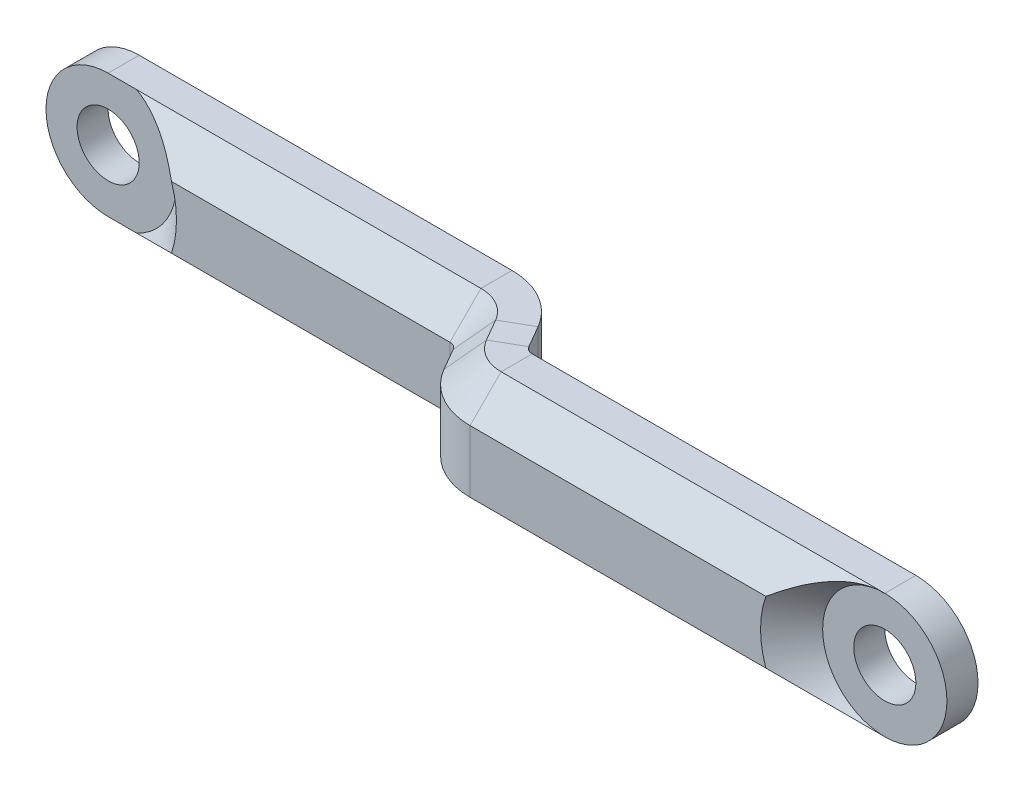
ISO-10303-21;
HEADER;
FILE_DESCRIPTION(('STEP AP214'),'2;1');
FILE_NAME('part.step','',(''),(''),'','','');
FILE_SCHEMA(('AUTOMOTIVE_DESIGN { 1 0 10303 214 1 1 1 1 }'));
ENDSEC;
DATA;
#1=APPLICATION_CONTEXT('core data for automotive mechanical design processes');
#2=APPLICATION_PROTOCOL_DEFINITION('international standard','automotive_design',2000,#1);
#3=PRODUCT_CONTEXT('',#1,'mechanical');
#4=PRODUCT('Part','Part','',(#3));
#5=PRODUCT_RELATED_PRODUCT_CATEGORY('part','',(#4));
#6=PRODUCT_DEFINITION_FORMATION('','',#4);
#7=PRODUCT_DEFINITION_CONTEXT('part definition',#1,'design');
#8=PRODUCT_DEFINITION('design','',#6,#7);
#9=PRODUCT_DEFINITION_SHAPE('','',#8);
#10=(LENGTH_UNIT() NAMED_UNIT(*) SI_UNIT(.MILLI.,.METRE.));
#11=(NAMED_UNIT(*) PLANE_ANGLE_UNIT() SI_UNIT($,.RADIAN.));
#12=(NAMED_UNIT(*) SI_UNIT($,.STERADIAN.) SOLID_ANGLE_UNIT());
#13=UNCERTAINTY_MEASURE_WITH_UNIT(LENGTH_MEASURE(1.E-05),#10,'distance_accuracy_value','');
#14=(GEOMETRIC_REPRESENTATION_CONTEXT(3) GLOBAL_UNCERTAINTY_ASSIGNED_CONTEXT((#13)) GLOBAL_UNIT_ASSIGNED_CONTEXT((#10,
#11,#12)) REPRESENTATION_CONTEXT('',''));
#15=CARTESIAN_POINT('',(0.,0.,0.));
#16=DIRECTION('',(0.,0.,1.));
#17=DIRECTION('',(1.,0.,0.));
#18=AXIS2_PLACEMENT_3D('',#15,#16,#17);
#19=CARTESIAN_POINT('',(67.5,0.,0.));
#20=DIRECTION('',(0.,0.,1.));
#21=DIRECTION('',(1.,0.,0.));
#22=AXIS2_PLACEMENT_3D('',#19,#20,#21);
#23=CYLINDRICAL_SURFACE('',#22,5.);
#24=DIRECTION('',(0.,0.,1.));
#25=VECTOR('',#24,1.);
#26=CARTESIAN_POINT('',(67.5,5.,0.));
#27=LINE('',#26,#25);
#28=CARTESIAN_POINT('',(67.5,5.,0.));
#29=VERTEX_POINT('',#28);
#30=CARTESIAN_POINT('',(67.5,5.,2.50000000000002));
#31=VERTEX_POINT('',#30);
#32=EDGE_CURVE('E180',#29,#31,#27,.T.);
#33=ORIENTED_EDGE('',*,*,#32,.T.);
#34=CARTESIAN_POINT('',(67.5,0.,2.50000000000002));
#35=DIRECTION('',(0.,0.,1.));
#36=DIRECTION('',(1.,0.,0.));
#37=AXIS2_PLACEMENT_3D('',#34,#35,#36);
#38=CIRCLE('',#37,5.);
#39=CARTESIAN_POINT('',(67.5,-5.,2.50000000000002));
#40=VERTEX_POINT('',#39);
#41=EDGE_CURVE('E192',#40,#31,#38,.T.);
#42=ORIENTED_EDGE('',*,*,#41,.F.);
#43=DIRECTION('',(0.,0.,1.));
#44=VECTOR('',#43,1.);
#45=CARTESIAN_POINT('',(67.5,-5.,0.));
#46=LINE('',#45,#44);
#47=CARTESIAN_POINT('',(67.5,-5.,0.));
#48=VERTEX_POINT('',#47);
#49=EDGE_CURVE('E230',#48,#40,#46,.T.);
#50=ORIENTED_EDGE('',*,*,#49,.F.);
#51=CARTESIAN_POINT('',(67.5,0.,0.));
#52=DIRECTION('',(0.,0.,1.));
#53=DIRECTION('',(1.,0.,0.));
#54=AXIS2_PLACEMENT_3D('',#51,#52,#53);
#55=CIRCLE('',#54,5.);
#56=EDGE_CURVE('E203',#48,#29,#55,.T.);
#57=ORIENTED_EDGE('',*,*,#56,.T.);
#58=EDGE_LOOP('',(#33,#42,#50,#57));
#59=FACE_BOUND('',#58,.T.);
#60=ADVANCED_FACE('F45',(#59),#23,.T.);
#61=CARTESIAN_POINT('',(67.5,0.,0.));
#62=DIRECTION('',(0.,0.,1.));
#63=DIRECTION('',(1.,0.,0.));
#64=AXIS2_PLACEMENT_3D('',#61,#62,#63);
#65=CYLINDRICAL_SURFACE('',#64,2.5);
#66=CARTESIAN_POINT('',(67.5,0.,0.));
#67=DIRECTION('',(0.,0.,1.));
#68=DIRECTION('',(1.,0.,0.));
#69=AXIS2_PLACEMENT_3D('',#66,#67,#68);
#70=CIRCLE('',#69,2.5);
#71=CARTESIAN_POINT('',(70.,0.,0.));
#72=VERTEX_POINT('',#71);
#73=EDGE_CURVE('E204',#72,#72,#70,.T.);
#74=ORIENTED_EDGE('',*,*,#73,.F.);
#75=EDGE_LOOP('',(#74));
#76=FACE_BOUND('',#75,.T.);
#77=CARTESIAN_POINT('',(67.5,0.,2.50000000000002));
#78=DIRECTION('',(0.,0.,1.));
#79=DIRECTION('',(1.,0.,0.));
#80=AXIS2_PLACEMENT_3D('',#77,#78,#79);
#81=CIRCLE('',#80,2.5);
#82=CARTESIAN_POINT('',(70.,0.,2.50000000000002));
#83=VERTEX_POINT('',#82);
#84=EDGE_CURVE('E220',#83,#83,#81,.F.);
#85=ORIENTED_EDGE('',*,*,#84,.F.);
#86=EDGE_LOOP('',(#85));
#87=FACE_BOUND('',#86,.T.);
#88=ADVANCED_FACE('F472',(#76,#87),#65,.F.);
#89=CARTESIAN_POINT('',(0.,0.,-5.));
#90=DIRECTION('',(0.,0.,1.));
#91=DIRECTION('',(1.,0.,0.));
#92=AXIS2_PLACEMENT_3D('',#89,#90,#91);
#93=CYLINDRICAL_SURFACE('',#92,2.5);
#94=CARTESIAN_POINT('',(0.,0.,-5.));
#95=DIRECTION('',(0.,0.,1.));
#96=DIRECTION('',(1.,0.,0.));
#97=AXIS2_PLACEMENT_3D('',#94,#95,#96);
#98=CIRCLE('',#97,2.5);
#99=CARTESIAN_POINT('',(2.5,0.,-5.));
#100=VERTEX_POINT('',#99);
#101=EDGE_CURVE('E277',#100,#100,#98,.T.);
#102=ORIENTED_EDGE('',*,*,#101,.F.);
#103=EDGE_LOOP('',(#102));
#104=FACE_BOUND('',#103,.T.);
#105=CARTESIAN_POINT('',(0.,0.,-2.5));
#106=DIRECTION('',(0.,0.,1.));
#107=DIRECTION('',(1.,0.,0.));
#108=AXIS2_PLACEMENT_3D('',#105,#106,#107);
#109=CIRCLE('',#108,2.5);
#110=CARTESIAN_POINT('',(2.5,0.,-2.5));
#111=VERTEX_POINT('',#110);
#112=EDGE_CURVE('E226',#111,#111,#109,.F.);
#113=ORIENTED_EDGE('',*,*,#112,.F.);
#114=EDGE_LOOP('',(#113));
#115=FACE_BOUND('',#114,.T.);
#116=ADVANCED_FACE('F477',(#104,#115),#93,.F.);
#117=CARTESIAN_POINT('',(0.,0.,-5.));
#118=DIRECTION('',(0.,0.,1.));
#119=DIRECTION('',(1.,0.,0.));
#120=AXIS2_PLACEMENT_3D('',#117,#118,#119);
#121=CYLINDRICAL_SURFACE('',#120,5.);
#122=DIRECTION('',(0.,0.,1.));
#123=VECTOR('',#122,1.);
#124=CARTESIAN_POINT('',(0.,-5.,-5.));
#125=LINE('',#124,#123);
#126=CARTESIAN_POINT('',(0.,-5.,-5.));
#127=VERTEX_POINT('',#126);
#128=CARTESIAN_POINT('',(0.,-5.,-2.5));
#129=VERTEX_POINT('',#128);
#130=EDGE_CURVE('E280',#127,#129,#125,.T.);
#131=ORIENTED_EDGE('',*,*,#130,.T.);
#132=CARTESIAN_POINT('',(0.,0.,-2.5));
#133=DIRECTION('',(0.,0.,1.));
#134=DIRECTION('',(1.,0.,0.));
#135=AXIS2_PLACEMENT_3D('',#132,#133,#134);
#136=CIRCLE('',#135,5.);
#137=CARTESIAN_POINT('',(0.,5.,-2.5));
#138=VERTEX_POINT('',#137);
#139=EDGE_CURVE('E222',#138,#129,#136,.T.);
#140=ORIENTED_EDGE('',*,*,#139,.F.);
#141=DIRECTION('',(0.,0.,1.));
#142=VECTOR('',#141,1.);
#143=CARTESIAN_POINT('',(0.,5.,-5.));
#144=LINE('',#143,#142);
#145=CARTESIAN_POINT('',(0.,5.,-5.));
#146=VERTEX_POINT('',#145);
#147=EDGE_CURVE('E261',#146,#138,#144,.T.);
#148=ORIENTED_EDGE('',*,*,#147,.F.);
#149=CARTESIAN_POINT('',(0.,0.,-5.));
#150=DIRECTION('',(0.,0.,1.));
#151=DIRECTION('',(1.,0.,0.));
#152=AXIS2_PLACEMENT_3D('',#149,#150,#151);
#153=CIRCLE('',#152,5.);
#154=EDGE_CURVE('E283',#146,#127,#153,.T.);
#155=ORIENTED_EDGE('',*,*,#154,.T.);
#156=EDGE_LOOP('',(#131,#140,#148,#155));
#157=FACE_BOUND('',#156,.T.);
#158=ADVANCED_FACE('F533',(#157),#121,.T.);
#159=CARTESIAN_POINT('',(18.2733615342484,5.,-31.0477336246734));
#160=DIRECTION('',(0.,1.,0.));
#161=DIRECTION('',(-0.86602540378444,0.,0.499999999999998));
#162=AXIS2_PLACEMENT_3D('',#159,#160,#161);
#163=PLANE('',#162);
#164=DIRECTION('',(0.86602540378444,0.,-0.499999999999998));
#165=VECTOR('',#164,1.);
#166=CARTESIAN_POINT('',(34.9680413313498,5.,-2.13169999999999));
#167=LINE('',#166,#165);
#168=CARTESIAN_POINT('',(32.8029778218887,5.,-0.88169999999999));
#169=VERTEX_POINT('',#168);
#170=CARTESIAN_POINT('',(34.9680413313498,5.,-2.13169999999999));
#171=VERTEX_POINT('',#170);
#172=EDGE_CURVE('E298',#169,#171,#167,.T.);
#173=ORIENTED_EDGE('',*,*,#172,.F.);
#174=DIRECTION('',(0.499999999999998,0.,0.86602540378444));
#175=VECTOR('',#174,1.);
#176=CARTESIAN_POINT('',(16.1082980247873,5.,-29.7977336246734));
#177=LINE('',#176,#175);
#178=CARTESIAN_POINT('',(33.8210772865777,5.,0.881700000000015));
#179=VERTEX_POINT('',#178);
#180=EDGE_CURVE('E340',#169,#179,#177,.T.);
#181=ORIENTED_EDGE('',*,*,#180,.T.);
#182=DIRECTION('',(0.86602540378444,0.,-0.499999999999998));
#183=VECTOR('',#182,1.);
#184=CARTESIAN_POINT('',(35.9861407960388,5.,-0.368299999999985));
#185=LINE('',#184,#183);
#186=CARTESIAN_POINT('',(35.9861407960388,5.,-0.368299999999986));
#187=VERTEX_POINT('',#186);
#188=EDGE_CURVE('E303',#179,#187,#185,.T.);
#189=ORIENTED_EDGE('',*,*,#188,.T.);
#190=DIRECTION('',(-0.499999999999998,0.,-0.86602540378444));
#191=VECTOR('',#190,1.);
#192=CARTESIAN_POINT('',(18.2733615342484,5.,-31.0477336246734));
#193=LINE('',#192,#191);
#194=EDGE_CURVE('E292',#187,#171,#193,.T.);
#195=ORIENTED_EDGE('',*,*,#194,.T.);
#196=EDGE_LOOP('',(#173,#181,#189,#195));
#197=FACE_BOUND('',#196,.T.);
#198=ADVANCED_FACE('F537',(#197),#163,.T.);
#199=CARTESIAN_POINT('',(18.2733615342484,-5.,-31.0477336246734));
#200=DIRECTION('',(0.,-1.,0.));
#201=DIRECTION('',(0.86602540378444,0.,-0.499999999999998));
#202=AXIS2_PLACEMENT_3D('',#199,#200,#201);
#203=PLANE('',#202);
#204=DIRECTION('',(-0.86602540378444,0.,0.499999999999998));
#205=VECTOR('',#204,1.);
#206=CARTESIAN_POINT('',(35.9861407960388,-5.,-0.368299999999985));
#207=LINE('',#206,#205);
#208=CARTESIAN_POINT('',(35.9861407960388,-5.,-0.368299999999988));
#209=VERTEX_POINT('',#208);
#210=CARTESIAN_POINT('',(33.8210772865777,-5.,0.881700000000015));
#211=VERTEX_POINT('',#210);
#212=EDGE_CURVE('E308',#209,#211,#207,.T.);
#213=ORIENTED_EDGE('',*,*,#212,.T.);
#214=DIRECTION('',(-0.499999999999998,0.,-0.86602540378444));
#215=VECTOR('',#214,1.);
#216=CARTESIAN_POINT('',(16.1082980247873,-5.,-29.7977336246734));
#217=LINE('',#216,#215);
#218=CARTESIAN_POINT('',(32.8029778218887,-5.,-0.88169999999999));
#219=VERTEX_POINT('',#218);
#220=EDGE_CURVE('E338',#211,#219,#217,.T.);
#221=ORIENTED_EDGE('',*,*,#220,.T.);
#222=DIRECTION('',(-0.86602540378444,0.,0.499999999999998));
#223=VECTOR('',#222,1.);
#224=CARTESIAN_POINT('',(34.9680413313498,-5.,-2.13169999999999));
#225=LINE('',#224,#223);
#226=CARTESIAN_POINT('',(34.9680413313498,-5.,-2.13169999999999));
#227=VERTEX_POINT('',#226);
#228=EDGE_CURVE('E291',#227,#219,#225,.T.);
#229=ORIENTED_EDGE('',*,*,#228,.F.);
#230=DIRECTION('',(0.499999999999998,0.,0.86602540378444));
#231=VECTOR('',#230,1.);
#232=CARTESIAN_POINT('',(18.2733615342484,-5.,-31.0477336246734));
#233=LINE('',#232,#231);
#234=EDGE_CURVE('E263',#227,#209,#233,.T.);
#235=ORIENTED_EDGE('',*,*,#234,.T.);
#236=EDGE_LOOP('',(#213,#221,#229,#235));
#237=FACE_BOUND('',#236,.T.);
#238=ADVANCED_FACE('F451',(#237),#203,.T.);
#239=CARTESIAN_POINT('',(13.9432345153262,0.,-28.5477336246734));
#240=DIRECTION('',(-0.86602540378444,0.,0.499999999999998));
#241=DIRECTION('',(0.499999999999998,0.,0.86602540378444));
#242=AXIS2_PLACEMENT_3D('',#239,#240,#241);
#243=PLANE('',#242);
#244=DIRECTION('',(0.,1.,0.));
#245=VECTOR('',#244,1.);
#246=CARTESIAN_POINT('',(30.6379143124276,0.,0.368299999999999));
#247=LINE('',#246,#245);
#248=CARTESIAN_POINT('',(30.6379143124276,-2.50000000000001,0.368299999999999));
#249=VERTEX_POINT('',#248);
#250=CARTESIAN_POINT('',(30.6379143124276,2.50000000000001,0.368299999999999));
#251=VERTEX_POINT('',#250);
#252=EDGE_CURVE('E295',#249,#251,#247,.T.);
#253=ORIENTED_EDGE('',*,*,#252,.F.);
#254=DIRECTION('',(0.499999999999998,0.,0.86602540378444));
#255=VECTOR('',#254,1.);
#256=CARTESIAN_POINT('',(13.9432345153262,-2.50000000000001,-28.5477336246734));
#257=LINE('',#256,#255);
#258=CARTESIAN_POINT('',(31.6560137771166,-2.50000000000001,2.1317));
#259=VERTEX_POINT('',#258);
#260=EDGE_CURVE('E336',#249,#259,#257,.T.);
#261=ORIENTED_EDGE('',*,*,#260,.T.);
#262=DIRECTION('',(0.,1.,0.));
#263=VECTOR('',#262,1.);
#264=CARTESIAN_POINT('',(31.6560137771166,0.,2.1317));
#265=LINE('',#264,#263);
#266=CARTESIAN_POINT('',(31.6560137771166,2.50000000000001,2.1317));
#267=VERTEX_POINT('',#266);
#268=EDGE_CURVE('E305',#259,#267,#265,.T.);
#269=ORIENTED_EDGE('',*,*,#268,.T.);
#270=DIRECTION('',(-0.499999999999998,0.,-0.86602540378444));
#271=VECTOR('',#270,1.);
#272=CARTESIAN_POINT('',(13.9432345153262,2.50000000000001,-28.5477336246734));
#273=LINE('',#272,#271);
#274=EDGE_CURVE('E334',#267,#251,#273,.T.);
#275=ORIENTED_EDGE('',*,*,#274,.T.);
#276=EDGE_LOOP('',(#253,#261,#269,#275));
#277=FACE_BOUND('',#276,.T.);
#278=ADVANCED_FACE('F557',(#277),#243,.T.);
#279=CARTESIAN_POINT('',(18.2733615342484,0.,-31.0477336246734));
#280=DIRECTION('',(-0.86602540378444,0.,0.499999999999998));
#281=DIRECTION('',(0.499999999999998,0.,0.86602540378444));
#282=AXIS2_PLACEMENT_3D('',#279,#280,#281);
#283=PLANE('',#282);
#284=DIRECTION('',(0.,1.,0.));
#285=VECTOR('',#284,1.);
#286=CARTESIAN_POINT('',(35.9861407960388,0.,-0.368299999999985));
#287=LINE('',#286,#285);
#288=EDGE_CURVE('E300',#209,#187,#287,.T.);
#289=ORIENTED_EDGE('',*,*,#288,.F.);
#290=ORIENTED_EDGE('',*,*,#234,.F.);
#291=DIRECTION('',(0.,1.,0.));
#292=VECTOR('',#291,1.);
#293=CARTESIAN_POINT('',(34.9680413313498,0.,-2.13169999999999));
#294=LINE('',#293,#292);
#295=EDGE_CURVE('E288',#227,#171,#294,.T.);
#296=ORIENTED_EDGE('',*,*,#295,.T.);
#297=ORIENTED_EDGE('',*,*,#194,.F.);
#298=EDGE_LOOP('',(#289,#290,#296,#297));
#299=FACE_BOUND('',#298,.T.);
#300=ADVANCED_FACE('F543',(#299),#283,.F.);
#301=CARTESIAN_POINT('',(0.,0.,-5.));
#302=DIRECTION('',(0.,0.,1.));
#303=DIRECTION('',(1.,0.,0.));
#304=AXIS2_PLACEMENT_3D('',#301,#302,#303);
#305=PLANE('',#304);
#306=DIRECTION('',(0.,1.,0.));
#307=VECTOR('',#306,1.);
#308=CARTESIAN_POINT('',(30.,0.,-5.));
#309=LINE('',#308,#307);
#310=CARTESIAN_POINT('',(30.,-5.,-5.));
#311=VERTEX_POINT('',#310);
#312=CARTESIAN_POINT('',(30.,5.,-5.));
#313=VERTEX_POINT('',#312);
#314=EDGE_CURVE('E260',#311,#313,#309,.T.);
#315=ORIENTED_EDGE('',*,*,#314,.F.);
#316=DIRECTION('',(1.,0.,0.));
#317=VECTOR('',#316,1.);
#318=CARTESIAN_POINT('',(0.,-5.,-5.));
#319=LINE('',#318,#317);
#320=EDGE_CURVE('E274',#127,#311,#319,.T.);
#321=ORIENTED_EDGE('',*,*,#320,.F.);
#322=ORIENTED_EDGE('',*,*,#154,.F.);
#323=DIRECTION('',(-1.,0.,0.));
#324=VECTOR('',#323,1.);
#325=CARTESIAN_POINT('',(0.,5.,-5.));
#326=LINE('',#325,#324);
#327=EDGE_CURVE('E264',#313,#146,#326,.T.);
#328=ORIENTED_EDGE('',*,*,#327,.F.);
#329=EDGE_LOOP('',(#315,#321,#322,#328));
#330=FACE_BOUND('',#329,.T.);
#331=ORIENTED_EDGE('',*,*,#101,.T.);
#332=EDGE_LOOP('',(#331));
#333=FACE_BOUND('',#332,.T.);
#334=ADVANCED_FACE('F539',(#330,#333),#305,.F.);
#335=CARTESIAN_POINT('',(0.,-5.,-5.));
#336=DIRECTION('',(0.,-1.,0.));
#337=DIRECTION('',(0.,0.,-1.));
#338=AXIS2_PLACEMENT_3D('',#335,#336,#337);
#339=PLANE('',#338);
#340=DIRECTION('',(0.,0.,1.));
#341=VECTOR('',#340,1.);
#342=CARTESIAN_POINT('',(30.,-5.,-5.));
#343=LINE('',#342,#341);
#344=CARTESIAN_POINT('',(30.,-5.,-2.49999999999999));
#345=VERTEX_POINT('',#344);
#346=EDGE_CURVE('E271',#311,#345,#343,.T.);
#347=ORIENTED_EDGE('',*,*,#346,.T.);
#348=DIRECTION('',(-1.,0.,0.));
#349=VECTOR('',#348,1.);
#350=CARTESIAN_POINT('',(0.,-5.,-2.49999999999998));
#351=LINE('',#350,#349);
#352=CARTESIAN_POINT('',(2.29128784747803,-5.,-2.5));
#353=VERTEX_POINT('',#352);
#354=EDGE_CURVE('E321',#345,#353,#351,.T.);
#355=ORIENTED_EDGE('',*,*,#354,.T.);
#356=EDGE_CURVE('E320',#353,#129,#351,.T.);
#357=ORIENTED_EDGE('',*,*,#356,.T.);
#358=ORIENTED_EDGE('',*,*,#130,.F.);
#359=ORIENTED_EDGE('',*,*,#320,.T.);
#360=EDGE_LOOP('',(#347,#355,#357,#358,#359));
#361=FACE_BOUND('',#360,.T.);
#362=ADVANCED_FACE('F542',(#361),#339,.T.);
#363=CARTESIAN_POINT('',(0.,0.,0.));
#364=DIRECTION('',(0.,0.,1.));
#365=DIRECTION('',(1.,0.,0.));
#366=AXIS2_PLACEMENT_3D('',#363,#364,#365);
#367=PLANE('',#366);
#368=DIRECTION('',(-1.,0.,0.));
#369=VECTOR('',#368,1.);
#370=CARTESIAN_POINT('',(0.,2.50000000000001,0.));
#371=LINE('',#370,#369);
#372=CARTESIAN_POINT('',(30.,2.50000000000001,0.));
#373=VERTEX_POINT('',#372);
#374=CARTESIAN_POINT('',(7.59934207678535,2.50000000000001,0.));
#375=VERTEX_POINT('',#374);
#376=EDGE_CURVE('E311',#373,#375,#371,.T.);
#377=ORIENTED_EDGE('',*,*,#376,.T.);
#378=CARTESIAN_POINT('',(0.,0.,0.));
#379=DIRECTION('',(0.,0.,1.));
#380=DIRECTION('',(1.,0.,0.));
#381=AXIS2_PLACEMENT_3D('',#378,#379,#380);
#382=CIRCLE('',#381,8.00000000000002);
#383=CARTESIAN_POINT('',(7.59934207678535,-2.50000000000001,0.));
#384=VERTEX_POINT('',#383);
#385=EDGE_CURVE('E431',#375,#384,#382,.F.);
#386=ORIENTED_EDGE('',*,*,#385,.T.);
#387=DIRECTION('',(1.,0.,0.));
#388=VECTOR('',#387,1.);
#389=CARTESIAN_POINT('',(0.,-2.50000000000001,0.));
#390=LINE('',#389,#388);
#391=CARTESIAN_POINT('',(30.,-2.50000000000001,0.));
#392=VERTEX_POINT('',#391);
#393=EDGE_CURVE('E318',#384,#392,#390,.T.);
#394=ORIENTED_EDGE('',*,*,#393,.T.);
#395=DIRECTION('',(0.,1.,0.));
#396=VECTOR('',#395,1.);
#397=CARTESIAN_POINT('',(30.,0.,0.));
#398=LINE('',#397,#396);
#399=EDGE_CURVE('E268',#392,#373,#398,.T.);
#400=ORIENTED_EDGE('',*,*,#399,.T.);
#401=EDGE_LOOP('',(#377,#386,#394,#400));
#402=FACE_BOUND('',#401,.T.);
#403=ADVANCED_FACE('F547',(#402),#367,.T.);
#404=CARTESIAN_POINT('',(0.,5.,-5.));
#405=DIRECTION('',(0.,1.,0.));
#406=DIRECTION('',(0.,0.,1.));
#407=AXIS2_PLACEMENT_3D('',#404,#405,#406);
#408=PLANE('',#407);
#409=ORIENTED_EDGE('',*,*,#147,.T.);
#410=DIRECTION('',(1.,0.,0.));
#411=VECTOR('',#410,1.);
#412=CARTESIAN_POINT('',(0.,5.,-2.49999999999998));
#413=LINE('',#412,#411);
#414=CARTESIAN_POINT('',(2.29128784747807,5.,-2.49999999999998));
#415=VERTEX_POINT('',#414);
#416=EDGE_CURVE('E61',#138,#415,#413,.T.);
#417=ORIENTED_EDGE('',*,*,#416,.T.);
#418=CARTESIAN_POINT('',(30.,5.,-2.49999999999998));
#419=VERTEX_POINT('',#418);
#420=EDGE_CURVE('E324',#415,#419,#413,.T.);
#421=ORIENTED_EDGE('',*,*,#420,.T.);
#422=DIRECTION('',(0.,0.,-1.));
#423=VECTOR('',#422,1.);
#424=CARTESIAN_POINT('',(30.,5.,-5.));
#425=LINE('',#424,#423);
#426=EDGE_CURVE('E266',#419,#313,#425,.T.);
#427=ORIENTED_EDGE('',*,*,#426,.T.);
#428=ORIENTED_EDGE('',*,*,#327,.T.);
#429=EDGE_LOOP('',(#409,#417,#421,#427,#428));
#430=FACE_BOUND('',#429,.T.);
#431=ADVANCED_FACE('F526',(#430),#408,.T.);
#432=CARTESIAN_POINT('',(30.,-5.,0.7366));
#433=DIRECTION('',(0.,-1.,0.));
#434=DIRECTION('',(0.,0.,-1.));
#435=AXIS2_PLACEMENT_3D('',#432,#433,#434);
#436=PLANE('',#435);
#437=ORIENTED_EDGE('',*,*,#228,.T.);
#438=CARTESIAN_POINT('',(30.,-5.,0.7366));
#439=DIRECTION('',(0.,-1.,0.));
#440=DIRECTION('',(0.,0.,-1.));
#441=AXIS2_PLACEMENT_3D('',#438,#439,#440);
#442=CIRCLE('',#441,3.23659999999999);
#443=EDGE_CURVE('E326',#219,#345,#442,.F.);
#444=ORIENTED_EDGE('',*,*,#443,.T.);
#445=ORIENTED_EDGE('',*,*,#346,.F.);
#446=CARTESIAN_POINT('',(30.,-5.,0.7366));
#447=DIRECTION('',(0.,1.,0.));
#448=DIRECTION('',(0.,0.,-1.));
#449=AXIS2_PLACEMENT_3D('',#446,#447,#448);
#450=CIRCLE('',#449,5.7366);
#451=EDGE_CURVE('E254',#227,#311,#450,.T.);
#452=ORIENTED_EDGE('',*,*,#451,.F.);
#453=EDGE_LOOP('',(#437,#444,#445,#452));
#454=FACE_BOUND('',#453,.T.);
#455=ADVANCED_FACE('F523',(#454),#436,.T.);
#456=CARTESIAN_POINT('',(30.,5.,0.7366));
#457=DIRECTION('',(0.,1.,0.));
#458=DIRECTION('',(0.,0.,1.));
#459=AXIS2_PLACEMENT_3D('',#456,#457,#458);
#460=PLANE('',#459);
#461=ORIENTED_EDGE('',*,*,#426,.F.);
#462=CARTESIAN_POINT('',(30.,5.,0.7366));
#463=DIRECTION('',(0.,1.,0.));
#464=DIRECTION('',(0.,0.,1.));
#465=AXIS2_PLACEMENT_3D('',#462,#463,#464);
#466=CIRCLE('',#465,3.23659999999998);
#467=EDGE_CURVE('E332',#419,#169,#466,.F.);
#468=ORIENTED_EDGE('',*,*,#467,.T.);
#469=ORIENTED_EDGE('',*,*,#172,.T.);
#470=CARTESIAN_POINT('',(30.,5.,0.7366));
#471=DIRECTION('',(0.,-1.,0.));
#472=DIRECTION('',(0.,0.,1.));
#473=AXIS2_PLACEMENT_3D('',#470,#471,#472);
#474=CIRCLE('',#473,5.7366);
#475=EDGE_CURVE('E257',#313,#171,#474,.T.);
#476=ORIENTED_EDGE('',*,*,#475,.F.);
#477=EDGE_LOOP('',(#461,#468,#469,#476));
#478=FACE_BOUND('',#477,.T.);
#479=ADVANCED_FACE('F518',(#478),#460,.T.);
#480=CARTESIAN_POINT('',(30.,11.6827975442021,0.7366));
#481=DIRECTION('',(0.,-1.,0.));
#482=DIRECTION('',(0.,0.,-1.));
#483=AXIS2_PLACEMENT_3D('',#480,#481,#482);
#484=CYLINDRICAL_SURFACE('',#483,5.7366);
#485=ORIENTED_EDGE('',*,*,#314,.T.);
#486=ORIENTED_EDGE('',*,*,#475,.T.);
#487=ORIENTED_EDGE('',*,*,#295,.F.);
#488=ORIENTED_EDGE('',*,*,#451,.T.);
#489=EDGE_LOOP('',(#485,#486,#487,#488));
#490=FACE_BOUND('',#489,.T.);
#491=ADVANCED_FACE('F515',(#490),#484,.T.);
#492=CARTESIAN_POINT('',(30.,11.6827975442021,0.7366));
#493=DIRECTION('',(0.,-1.,0.));
#494=DIRECTION('',(0.,0.,-1.));
#495=AXIS2_PLACEMENT_3D('',#492,#493,#494);
#496=CYLINDRICAL_SURFACE('',#495,0.7366);
#497=ORIENTED_EDGE('',*,*,#399,.F.);
#498=CARTESIAN_POINT('',(30.,-2.50000000000001,0.7366));
#499=DIRECTION('',(0.,-1.,0.));
#500=DIRECTION('',(0.,0.,-1.));
#501=AXIS2_PLACEMENT_3D('',#498,#499,#500);
#502=CIRCLE('',#501,0.7366);
#503=EDGE_CURVE('E330',#392,#249,#502,.T.);
#504=ORIENTED_EDGE('',*,*,#503,.T.);
#505=ORIENTED_EDGE('',*,*,#252,.T.);
#506=CARTESIAN_POINT('',(30.,2.50000000000001,0.7366));
#507=DIRECTION('',(0.,1.,0.));
#508=DIRECTION('',(0.,0.,1.));
#509=AXIS2_PLACEMENT_3D('',#506,#507,#508);
#510=CIRCLE('',#509,0.7366);
#511=EDGE_CURVE('E328',#251,#373,#510,.T.);
#512=ORIENTED_EDGE('',*,*,#511,.T.);
#513=EDGE_LOOP('',(#497,#504,#505,#512));
#514=FACE_BOUND('',#513,.T.);
#515=ADVANCED_FACE('F510',(#514),#496,.F.);
#516=CARTESIAN_POINT('',(36.6240551084664,-5.,-0.736599999999983));
#517=DIRECTION('',(0.,1.,0.));
#518=DIRECTION('',(0.,0.,1.));
#519=AXIS2_PLACEMENT_3D('',#516,#517,#518);
#520=PLANE('',#519);
#521=DIRECTION('',(0.,0.,1.));
#522=VECTOR('',#521,1.);
#523=CARTESIAN_POINT('',(36.6240551084664,-5.,0.));
#524=LINE('',#523,#522);
#525=CARTESIAN_POINT('',(36.6240551084664,-5.,0.));
#526=VERTEX_POINT('',#525);
#527=CARTESIAN_POINT('',(36.6240551084664,-5.,2.50000000000003));
#528=VERTEX_POINT('',#527);
#529=EDGE_CURVE('E229',#526,#528,#524,.T.);
#530=ORIENTED_EDGE('',*,*,#529,.T.);
#531=CARTESIAN_POINT('',(36.6240551084664,-5.,-0.736599999999983));
#532=DIRECTION('',(0.,1.,0.));
#533=DIRECTION('',(0.,0.,1.));
#534=AXIS2_PLACEMENT_3D('',#531,#532,#533);
#535=CIRCLE('',#534,3.23660000000001);
#536=EDGE_CURVE('E342',#528,#211,#535,.F.);
#537=ORIENTED_EDGE('',*,*,#536,.T.);
#538=ORIENTED_EDGE('',*,*,#212,.F.);
#539=CARTESIAN_POINT('',(36.6240551084664,-5.,-0.736599999999983));
#540=DIRECTION('',(0.,-1.,0.));
#541=DIRECTION('',(0.,0.,1.));
#542=AXIS2_PLACEMENT_3D('',#539,#540,#541);
#543=CIRCLE('',#542,0.736600000000001);
#544=EDGE_CURVE('E232',#526,#209,#543,.T.);
#545=ORIENTED_EDGE('',*,*,#544,.F.);
#546=EDGE_LOOP('',(#530,#537,#538,#545));
#547=FACE_BOUND('',#546,.T.);
#548=ADVANCED_FACE('F507',(#547),#520,.F.);
#549=CARTESIAN_POINT('',(36.6240551084664,5.,-0.736599999999983));
#550=DIRECTION('',(0.,-1.,0.));
#551=DIRECTION('',(0.,0.,-1.));
#552=AXIS2_PLACEMENT_3D('',#549,#550,#551);
#553=PLANE('',#552);
#554=ORIENTED_EDGE('',*,*,#188,.F.);
#555=CARTESIAN_POINT('',(36.6240551084664,5.,-0.736599999999983));
#556=DIRECTION('',(0.,-1.,0.));
#557=DIRECTION('',(0.,0.,-1.));
#558=AXIS2_PLACEMENT_3D('',#555,#556,#557);
#559=CIRCLE('',#558,3.23660000000001);
#560=CARTESIAN_POINT('',(36.6240551084664,5.,2.50000000000003));
#561=VERTEX_POINT('',#560);
#562=EDGE_CURVE('E348',#179,#561,#559,.F.);
#563=ORIENTED_EDGE('',*,*,#562,.T.);
#564=DIRECTION('',(0.,0.,-1.));
#565=VECTOR('',#564,1.);
#566=CARTESIAN_POINT('',(36.6240551084664,5.,0.));
#567=LINE('',#566,#565);
#568=CARTESIAN_POINT('',(36.6240551084664,5.,0.));
#569=VERTEX_POINT('',#568);
#570=EDGE_CURVE('E182',#561,#569,#567,.T.);
#571=ORIENTED_EDGE('',*,*,#570,.T.);
#572=CARTESIAN_POINT('',(36.6240551084664,5.,-0.736599999999983));
#573=DIRECTION('',(0.,1.,0.));
#574=DIRECTION('',(0.,0.,-1.));
#575=AXIS2_PLACEMENT_3D('',#572,#573,#574);
#576=CIRCLE('',#575,0.736600000000001);
#577=EDGE_CURVE('E251',#187,#569,#576,.T.);
#578=ORIENTED_EDGE('',*,*,#577,.F.);
#579=EDGE_LOOP('',(#554,#563,#571,#578));
#580=FACE_BOUND('',#579,.T.);
#581=ADVANCED_FACE('F502',(#580),#553,.F.);
#582=CARTESIAN_POINT('',(36.6240551084664,12.8779064125431,-0.736599999999983));
#583=DIRECTION('',(0.,-1.,0.));
#584=DIRECTION('',(0.,0.,-1.));
#585=AXIS2_PLACEMENT_3D('',#582,#583,#584);
#586=CYLINDRICAL_SURFACE('',#585,0.7366);
#587=ORIENTED_EDGE('',*,*,#288,.T.);
#588=ORIENTED_EDGE('',*,*,#577,.T.);
#589=DIRECTION('',(0.,1.,0.));
#590=VECTOR('',#589,1.);
#591=CARTESIAN_POINT('',(36.6240551084664,0.,0.));
#592=LINE('',#591,#590);
#593=EDGE_CURVE('E237',#526,#569,#592,.T.);
#594=ORIENTED_EDGE('',*,*,#593,.F.);
#595=ORIENTED_EDGE('',*,*,#544,.T.);
#596=EDGE_LOOP('',(#587,#588,#594,#595));
#597=FACE_BOUND('',#596,.T.);
#598=ADVANCED_FACE('F499',(#597),#586,.F.);
#599=CARTESIAN_POINT('',(36.6240551084664,12.8779064125431,-0.736599999999983));
#600=DIRECTION('',(0.,-1.,0.));
#601=DIRECTION('',(0.,0.,-1.));
#602=AXIS2_PLACEMENT_3D('',#599,#600,#601);
#603=CYLINDRICAL_SURFACE('',#602,5.7366);
#604=ORIENTED_EDGE('',*,*,#268,.F.);
#605=CARTESIAN_POINT('',(36.6240551084664,-2.50000000000001,-0.736599999999983));
#606=DIRECTION('',(0.,-1.,0.));
#607=DIRECTION('',(0.,0.,-1.));
#608=AXIS2_PLACEMENT_3D('',#605,#606,#607);
#609=CIRCLE('',#608,5.7366);
#610=CARTESIAN_POINT('',(36.6240551084664,-2.50000000000001,5.00000000000002));
#611=VERTEX_POINT('',#610);
#612=EDGE_CURVE('E346',#259,#611,#609,.F.);
#613=ORIENTED_EDGE('',*,*,#612,.T.);
#614=DIRECTION('',(0.,1.,0.));
#615=VECTOR('',#614,1.);
#616=CARTESIAN_POINT('',(36.6240551084664,0.,5.00000000000002));
#617=LINE('',#616,#615);
#618=CARTESIAN_POINT('',(36.6240551084664,2.50000000000001,5.00000000000002));
#619=VERTEX_POINT('',#618);
#620=EDGE_CURVE('E244',#611,#619,#617,.T.);
#621=ORIENTED_EDGE('',*,*,#620,.T.);
#622=CARTESIAN_POINT('',(36.6240551084664,2.50000000000001,-0.736599999999983));
#623=DIRECTION('',(0.,1.,0.));
#624=DIRECTION('',(0.,0.,1.));
#625=AXIS2_PLACEMENT_3D('',#622,#623,#624);
#626=CIRCLE('',#625,5.7366);
#627=EDGE_CURVE('E344',#619,#267,#626,.F.);
#628=ORIENTED_EDGE('',*,*,#627,.T.);
#629=EDGE_LOOP('',(#604,#613,#621,#628));
#630=FACE_BOUND('',#629,.T.);
#631=ADVANCED_FACE('F487',(#630),#603,.T.);
#632=CARTESIAN_POINT('',(-2.1908630093174,0.,0.));
#633=DIRECTION('',(0.,0.,1.));
#634=DIRECTION('',(1.,0.,0.));
#635=AXIS2_PLACEMENT_3D('',#632,#633,#634);
#636=PLANE('',#635);
#637=ORIENTED_EDGE('',*,*,#73,.T.);
#638=EDGE_LOOP('',(#637));
#639=FACE_BOUND('',#638,.T.);
#640=DIRECTION('',(1.,0.,0.));
#641=VECTOR('',#640,1.);
#642=CARTESIAN_POINT('',(-2.1908630093174,-5.,0.));
#643=LINE('',#642,#641);
#644=EDGE_CURVE('E233',#526,#48,#643,.T.);
#645=ORIENTED_EDGE('',*,*,#644,.F.);
#646=ORIENTED_EDGE('',*,*,#593,.T.);
#647=DIRECTION('',(-1.,0.,0.));
#648=VECTOR('',#647,1.);
#649=CARTESIAN_POINT('',(-2.1908630093174,5.,0.));
#650=LINE('',#649,#648);
#651=EDGE_CURVE('E235',#29,#569,#650,.T.);
#652=ORIENTED_EDGE('',*,*,#651,.F.);
#653=ORIENTED_EDGE('',*,*,#56,.F.);
#654=EDGE_LOOP('',(#645,#646,#652,#653));
#655=FACE_BOUND('',#654,.T.);
#656=ADVANCED_FACE('F484',(#639,#655),#636,.F.);
#657=CARTESIAN_POINT('',(-2.1908630093174,5.,0.));
#658=DIRECTION('',(0.,1.,0.));
#659=DIRECTION('',(0.,0.,1.));
#660=AXIS2_PLACEMENT_3D('',#657,#658,#659);
#661=PLANE('',#660);
#662=ORIENTED_EDGE('',*,*,#570,.F.);
#663=DIRECTION('',(1.,0.,0.));
#664=VECTOR('',#663,1.);
#665=CARTESIAN_POINT('',(-2.1908630093174,5.,2.50000000000003));
#666=LINE('',#665,#664);
#667=EDGE_CURVE('E175',#561,#31,#666,.T.);
#668=ORIENTED_EDGE('',*,*,#667,.T.);
#669=ORIENTED_EDGE('',*,*,#32,.F.);
#670=ORIENTED_EDGE('',*,*,#651,.T.);
#671=EDGE_LOOP('',(#662,#668,#669,#670));
#672=FACE_BOUND('',#671,.T.);
#673=ADVANCED_FACE('F177',(#672),#661,.T.);
#674=CARTESIAN_POINT('',(-2.1908630093174,0.,5.00000000000002));
#675=DIRECTION('',(0.,0.,1.));
#676=DIRECTION('',(1.,0.,0.));
#677=AXIS2_PLACEMENT_3D('',#674,#675,#676);
#678=PLANE('',#677);
#679=ORIENTED_EDGE('',*,*,#620,.F.);
#680=DIRECTION('',(1.,0.,0.));
#681=VECTOR('',#680,1.);
#682=CARTESIAN_POINT('',(-2.1908630093174,-2.50000000000001,5.00000000000002));
#683=LINE('',#682,#681);
#684=CARTESIAN_POINT('',(60.4289321881346,-2.50000000000001,5.00000000000002));
#685=VERTEX_POINT('',#684);
#686=EDGE_CURVE('E353',#611,#685,#683,.T.);
#687=ORIENTED_EDGE('',*,*,#686,.T.);
#688=CARTESIAN_POINT('',(67.5,0.,5.00000000000002));
#689=DIRECTION('',(0.,0.,1.));
#690=DIRECTION('',(1.,0.,0.));
#691=AXIS2_PLACEMENT_3D('',#688,#689,#690);
#692=CIRCLE('',#691,7.49999999999999);
#693=CARTESIAN_POINT('',(60.4289321881346,2.50000000000001,5.00000000000002));
#694=VERTEX_POINT('',#693);
#695=EDGE_CURVE('E350',#685,#694,#692,.F.);
#696=ORIENTED_EDGE('',*,*,#695,.T.);
#697=DIRECTION('',(-1.,0.,0.));
#698=VECTOR('',#697,1.);
#699=CARTESIAN_POINT('',(-2.1908630093174,2.50000000000001,5.00000000000002));
#700=LINE('',#699,#698);
#701=EDGE_CURVE('E210',#694,#619,#700,.T.);
#702=ORIENTED_EDGE('',*,*,#701,.T.);
#703=EDGE_LOOP('',(#679,#687,#696,#702));
#704=FACE_BOUND('',#703,.T.);
#705=ADVANCED_FACE('F491',(#704),#678,.T.);
#706=CARTESIAN_POINT('',(-2.1908630093174,-5.,0.));
#707=DIRECTION('',(0.,-1.,0.));
#708=DIRECTION('',(0.,0.,-1.));
#709=AXIS2_PLACEMENT_3D('',#706,#707,#708);
#710=PLANE('',#709);
#711=ORIENTED_EDGE('',*,*,#49,.T.);
#712=DIRECTION('',(-1.,0.,0.));
#713=VECTOR('',#712,1.);
#714=CARTESIAN_POINT('',(-2.1908630093174,-5.,2.50000000000003));
#715=LINE('',#714,#713);
#716=EDGE_CURVE('E188',#40,#528,#715,.T.);
#717=ORIENTED_EDGE('',*,*,#716,.T.);
#718=ORIENTED_EDGE('',*,*,#529,.F.);
#719=ORIENTED_EDGE('',*,*,#644,.T.);
#720=EDGE_LOOP('',(#711,#717,#718,#719));
#721=FACE_BOUND('',#720,.T.);
#722=ADVANCED_FACE('F494',(#721),#710,.T.);
#723=CARTESIAN_POINT('',(0.,0.,-2.5));
#724=DIRECTION('',(0.,0.,1.));
#725=DIRECTION('',(1.,0.,0.));
#726=AXIS2_PLACEMENT_3D('',#723,#724,#725);
#727=PLANE('',#726);
#728=ORIENTED_EDGE('',*,*,#139,.T.);
#729=ORIENTED_EDGE('',*,*,#356,.F.);
#730=CARTESIAN_POINT('',(0.,0.,-2.5));
#731=DIRECTION('',(0.,0.,1.));
#732=DIRECTION('',(1.,0.,0.));
#733=AXIS2_PLACEMENT_3D('',#730,#731,#732);
#734=CIRCLE('',#733,5.50000000000005);
#735=EDGE_CURVE('E12',#353,#415,#734,.T.);
#736=ORIENTED_EDGE('',*,*,#735,.T.);
#737=ORIENTED_EDGE('',*,*,#416,.F.);
#738=EDGE_LOOP('',(#728,#729,#736,#737));
#739=FACE_BOUND('',#738,.T.);
#740=ORIENTED_EDGE('',*,*,#112,.T.);
#741=EDGE_LOOP('',(#740));
#742=FACE_BOUND('',#741,.T.);
#743=ADVANCED_FACE('F481',(#739,#742),#727,.T.);
#744=CARTESIAN_POINT('',(67.5,0.,2.50000000000002));
#745=DIRECTION('',(0.,0.,1.));
#746=DIRECTION('',(1.,0.,0.));
#747=AXIS2_PLACEMENT_3D('',#744,#745,#746);
#748=PLANE('',#747);
#749=EDGE_CURVE('E196',#31,#40,#38,.T.);
#750=ORIENTED_EDGE('',*,*,#749,.T.);
#751=ORIENTED_EDGE('',*,*,#41,.T.);
#752=EDGE_LOOP('',(#750,#751));
#753=FACE_BOUND('',#752,.T.);
#754=ORIENTED_EDGE('',*,*,#84,.T.);
#755=EDGE_LOOP('',(#754));
#756=FACE_BOUND('',#755,.T.);
#757=ADVANCED_FACE('F193',(#753,#756),#748,.T.);
#758=CARTESIAN_POINT('',(0.,2.50000000000001,0.));
#759=DIRECTION('',(0.,-0.707106781186547,-0.707106781186548));
#760=DIRECTION('',(-1.,0.,0.));
#761=AXIS2_PLACEMENT_3D('',#758,#759,#760);
#762=PLANE('',#761);
#763=ORIENTED_EDGE('',*,*,#420,.F.);
#764=CARTESIAN_POINT('',(2.29128784747807,5.,-2.49999999999998));
#765=CARTESIAN_POINT('',(2.80008153193284,4.88894027302858,-2.38894027302857));
#766=CARTESIAN_POINT('',(3.29134887151585,4.74479704400008,-2.24479704400006));
#767=CARTESIAN_POINT('',(3.9975289803059,4.49162579773215,-1.99162579773214));
#768=CARTESIAN_POINT('',(4.22622959168861,4.40186834028931,-1.9018683402893));
#769=CARTESIAN_POINT('',(4.67472054439727,4.2117765810288,-1.71177658102879));
#770=CARTESIAN_POINT('',(4.89450693690782,4.11143766118895,-1.61143766118894));
#771=CARTESIAN_POINT('',(5.33348813386453,3.89780482406871,-1.39780482406869));
#772=CARTESIAN_POINT('',(5.55234362225806,3.78416367155775,-1.28416367155774));
#773=CARTESIAN_POINT('',(5.98105651448417,3.54870969239381,-1.04870969239379));
#774=CARTESIAN_POINT('',(6.19091334399308,3.42689634543346,-0.926896345433444));
#775=CARTESIAN_POINT('',(6.60538673028728,3.17440642535743,-0.674406425357415));
#776=CARTESIAN_POINT('',(6.8098701079498,3.04362107594658,-0.543621075946563));
#777=CARTESIAN_POINT('',(7.21059316971285,2.77606010947652,-0.276060109476508));
#778=CARTESIAN_POINT('',(7.40683838873204,2.63928864467563,-0.13928864467562));
#779=CARTESIAN_POINT('',(7.59934207678535,2.50000000000001,0.));
#780=B_SPLINE_CURVE_WITH_KNOTS('',3,(#764,#765,#766,#767,#768,#769,#770,#771,#772,#773,#774,
#775,#776,#777,#778,#779),.UNSPECIFIED.,.F.,.F.,(4,2,2,2,2,2,2,4),(0.,1.5909064005779,
2.37490673115028,3.15925064682234,3.97337532117409,4.78755187850611,5.61445444921499,
6.44079225946453),.UNSPECIFIED.);
#781=EDGE_CURVE('E187',#415,#375,#780,.T.);
#782=ORIENTED_EDGE('',*,*,#781,.T.);
#783=ORIENTED_EDGE('',*,*,#376,.F.);
#784=DIRECTION('',(0.,-0.707106781186548,0.707106781186547));
#785=VECTOR('',#784,1.);
#786=CARTESIAN_POINT('',(30.,5.,-2.49999999999998));
#787=LINE('',#786,#785);
#788=EDGE_CURVE('E200',#419,#373,#787,.T.);
#789=ORIENTED_EDGE('',*,*,#788,.F.);
#790=EDGE_LOOP('',(#763,#782,#783,#789));
#791=FACE_BOUND('',#790,.T.);
#792=ADVANCED_FACE('F417',(#791),#762,.F.);
#793=CARTESIAN_POINT('',(30.,5.,0.7366));
#794=DIRECTION('',(0.,1.,0.));
#795=DIRECTION('',(0.,0.,1.));
#796=AXIS2_PLACEMENT_3D('',#793,#794,#795);
#797=CONICAL_SURFACE('',#796,3.23659999999999,0.785398163397448);
#798=ORIENTED_EDGE('',*,*,#788,.T.);
#799=ORIENTED_EDGE('',*,*,#511,.F.);
#800=DIRECTION('',(-0.612372435695795,-0.707106781186548,0.353553390593271));
#801=VECTOR('',#800,1.);
#802=CARTESIAN_POINT('',(32.8029778218887,5.,-0.881699999999986));
#803=LINE('',#802,#801);
#804=EDGE_CURVE('E595',#169,#251,#803,.T.);
#805=ORIENTED_EDGE('',*,*,#804,.F.);
#806=ORIENTED_EDGE('',*,*,#467,.F.);
#807=EDGE_LOOP('',(#798,#799,#805,#806));
#808=FACE_BOUND('',#807,.T.);
#809=ADVANCED_FACE('F411',(#808),#797,.F.);
#810=CARTESIAN_POINT('',(13.9432345153262,2.50000000000001,-28.5477336246734));
#811=DIRECTION('',(0.612372435695795,-0.707106781186548,-0.353553390593272));
#812=DIRECTION('',(-0.499999999999998,0.,-0.86602540378444));
#813=AXIS2_PLACEMENT_3D('',#810,#811,#812);
#814=PLANE('',#813);
#815=ORIENTED_EDGE('',*,*,#804,.T.);
#816=ORIENTED_EDGE('',*,*,#274,.F.);
#817=DIRECTION('',(-0.612372435695796,-0.707106781186547,0.353553390593272));
#818=VECTOR('',#817,1.);
#819=CARTESIAN_POINT('',(33.8210772865777,5.,0.881700000000014));
#820=LINE('',#819,#818);
#821=EDGE_CURVE('E596',#179,#267,#820,.T.);
#822=ORIENTED_EDGE('',*,*,#821,.F.);
#823=ORIENTED_EDGE('',*,*,#180,.F.);
#824=EDGE_LOOP('',(#815,#816,#822,#823));
#825=FACE_BOUND('',#824,.T.);
#826=ADVANCED_FACE('F404',(#825),#814,.F.);
#827=CARTESIAN_POINT('',(36.6240551084664,5.,-0.736599999999983));
#828=DIRECTION('',(0.,-1.,0.));
#829=DIRECTION('',(0.,0.,-1.));
#830=AXIS2_PLACEMENT_3D('',#827,#828,#829);
#831=CONICAL_SURFACE('',#830,3.23660000000001,0.785398163397448);
#832=ORIENTED_EDGE('',*,*,#821,.T.);
#833=ORIENTED_EDGE('',*,*,#627,.F.);
#834=DIRECTION('',(0.,-0.707106781186548,0.707106781186547));
#835=VECTOR('',#834,1.);
#836=CARTESIAN_POINT('',(36.6240551084664,5.,2.50000000000003));
#837=LINE('',#836,#835);
#838=EDGE_CURVE('E213',#561,#619,#837,.T.);
#839=ORIENTED_EDGE('',*,*,#838,.F.);
#840=ORIENTED_EDGE('',*,*,#562,.F.);
#841=EDGE_LOOP('',(#832,#833,#839,#840));
#842=FACE_BOUND('',#841,.T.);
#843=ADVANCED_FACE('F398',(#842),#831,.T.);
#844=CARTESIAN_POINT('',(-2.1908630093174,2.50000000000001,5.00000000000002));
#845=DIRECTION('',(0.,-0.707106781186547,-0.707106781186548));
#846=DIRECTION('',(-1.,0.,0.));
#847=AXIS2_PLACEMENT_3D('',#844,#845,#846);
#848=PLANE('',#847);
#849=ORIENTED_EDGE('',*,*,#838,.T.);
#850=ORIENTED_EDGE('',*,*,#701,.F.);
#851=CARTESIAN_POINT('',(67.5,5.,2.50000000000003));
#852=CARTESIAN_POINT('',(67.3977968787106,5.00000235600181,2.49999764399822));
#853=CARTESIAN_POINT('',(67.2956069275042,4.99843267536024,2.5015673246398));
#854=CARTESIAN_POINT('',(67.0914261627316,4.99217411385658,2.50782588614345));
#855=CARTESIAN_POINT('',(66.9894353340069,4.98748548051904,2.512514519481));
#856=CARTESIAN_POINT('',(66.6842573458799,4.96879406443877,2.53120593556126));
#857=CARTESIAN_POINT('',(66.4816018583304,4.95016563463644,2.54983436536359));
#858=CARTESIAN_POINT('',(66.0817961801248,4.90140878389957,2.59859121610047));
#859=CARTESIAN_POINT('',(65.8846087245085,4.87143062381285,2.62856937618719));
#860=CARTESIAN_POINT('',(65.4940870678543,4.80072327239261,2.69927672760743));
#861=CARTESIAN_POINT('',(65.3007541424172,4.75999058349628,2.74000941650375));
#862=CARTESIAN_POINT('',(64.8481151758093,4.65179720006357,2.84820279993646));
#863=CARTESIAN_POINT('',(64.5908660521702,4.5800234349487,2.91997656505133));
#864=CARTESIAN_POINT('',(64.0863816760216,4.42054665990884,3.07945334009119));
#865=CARTESIAN_POINT('',(63.8391517915078,4.33283524554996,3.16716475445007));
#866=CARTESIAN_POINT('',(63.4753076680437,4.19083612793327,3.30916387206676));
#867=CARTESIAN_POINT('',(63.3547229893917,4.14154512877738,3.35845487122265));
#868=CARTESIAN_POINT('',(63.1162695260297,4.03985565454799,3.46014434545204));
#869=CARTESIAN_POINT('',(62.9983996616586,3.98745844548979,3.51254155451024));
#870=CARTESIAN_POINT('',(62.6487599322108,3.82599096984804,3.67400903015199));
#871=CARTESIAN_POINT('',(62.4209252759464,3.71263116811989,3.78736883188014));
#872=CARTESIAN_POINT('',(62.0403089100019,3.51083454215755,3.98916545784248));
#873=CARTESIAN_POINT('',(61.8849930768102,3.42475383662263,4.0752461633774));
#874=CARTESIAN_POINT('',(61.5792238950824,3.24838891160749,4.25161108839254));
#875=CARTESIAN_POINT('',(61.4287702060101,3.15810498759918,4.34189501240085));
#876=CARTESIAN_POINT('',(61.1343192353966,2.97497648238569,4.52502351761434));
#877=CARTESIAN_POINT('',(60.9902650770671,2.8821774493643,4.61782255063573));
#878=CARTESIAN_POINT('',(60.7064481684757,2.6933865893977,4.80661341060233));
#879=CARTESIAN_POINT('',(60.5666846522529,2.5973953387731,4.90260466122694));
#880=CARTESIAN_POINT('',(60.4289321881346,2.50000000000001,5.00000000000002));
#881=B_SPLINE_CURVE_WITH_KNOTS('',3,(#851,#852,#853,#854,#855,#856,#857,#858,#859,#860,#861,
#862,#863,#864,#865,#866,#867,#868,#869,#870,#871,#872,#873,#874,#875,#876,#877,#878,#879,#880),
.UNSPECIFIED.,.F.,.F.,(4,2,2,2,2,2,2,2,2,2,2,2,2,2,4),(0.,0.306559471575794,0.613094617057444,
1.22537908645518,1.82982586071115,2.43446945439306,3.26282876881726,4.09162617813185,
4.50939493103756,4.92699456689457,5.76207502811351,6.35395834406106,6.94580011527148,
7.53031365926058,8.11472224246958),.UNSPECIFIED.);
#882=EDGE_CURVE('E208',#31,#694,#881,.T.);
#883=ORIENTED_EDGE('',*,*,#882,.F.);
#884=ORIENTED_EDGE('',*,*,#667,.F.);
#885=EDGE_LOOP('',(#849,#850,#883,#884));
#886=FACE_BOUND('',#885,.T.);
#887=ADVANCED_FACE('F209',(#886),#848,.F.);
#888=CARTESIAN_POINT('',(67.5,0.,2.50000000000003));
#889=DIRECTION('',(0.,0.,1.));
#890=DIRECTION('',(1.,0.,0.));
#891=AXIS2_PLACEMENT_3D('',#888,#889,#890);
#892=CONICAL_SURFACE('',#891,5.,0.785398163397449);
#893=ORIENTED_EDGE('',*,*,#882,.T.);
#894=ORIENTED_EDGE('',*,*,#695,.F.);
#895=CARTESIAN_POINT('',(60.4289321881346,-2.50000000000001,5.00000000000002));
#896=CARTESIAN_POINT('',(60.5585440355409,-2.59164145551574,4.90835854448428));
#897=CARTESIAN_POINT('',(60.6899361214558,-2.68203746726658,4.81796253273345));
#898=CARTESIAN_POINT('',(60.9565189236574,-2.86003346179967,4.63996653820036));
#899=CARTESIAN_POINT('',(61.0917106566028,-2.94763268260095,4.55236731739908));
#900=CARTESIAN_POINT('',(61.3666430820512,-3.12004505203107,4.37995494796896));
#901=CARTESIAN_POINT('',(61.5064006408158,-3.20484480345469,4.29515519654534));
#902=CARTESIAN_POINT('',(61.7900914409851,-3.37085275679414,4.1291472432059));
#903=CARTESIAN_POINT('',(61.9340243776063,-3.45206121977062,4.04793878022941));
#904=CARTESIAN_POINT('',(62.3783997713063,-3.69291265741518,3.80708734258485));
#905=CARTESIAN_POINT('',(62.6858279877259,-3.84622515134463,3.6537748486554));
#906=CARTESIAN_POINT('',(63.3196321904285,-4.13123120515937,3.36876879484066));
#907=CARTESIAN_POINT('',(63.6459725971411,-4.26296368374957,3.23703631625047));
#908=CARTESIAN_POINT('',(64.1821107219697,-4.45158613438576,3.04841386561428));
#909=CARTESIAN_POINT('',(64.3857782762252,-4.51722248219349,2.98277751780654));
#910=CARTESIAN_POINT('',(64.7995943492186,-4.63753023000584,2.86246976999419));
#911=CARTESIAN_POINT('',(65.009744037896,-4.6921996371033,2.80780036289674));
#912=CARTESIAN_POINT('',(65.4339315183036,-4.78879813360119,2.71120186639884));
#913=CARTESIAN_POINT('',(65.6479227561392,-4.83082888907537,2.66917111092466));
#914=CARTESIAN_POINT('',(66.0801945324804,-4.90154070015655,2.59845929984348));
#915=CARTESIAN_POINT('',(66.2984724814018,-4.9302295717842,2.56977042821583));
#916=CARTESIAN_POINT('',(66.6804591427247,-4.96773479282898,2.53226520717106));
#917=CARTESIAN_POINT('',(66.8435433253884,-4.97978337343618,2.52021662656385));
#918=CARTESIAN_POINT('',(67.1710727787618,-4.99594212080979,2.50405787919025));
#919=CARTESIAN_POINT('',(67.3355208222075,-5.00002410446022,2.49997589553981));
#920=CARTESIAN_POINT('',(67.5,-5.,2.50000000000003));
#921=B_SPLINE_CURVE_WITH_KNOTS('',3,(#895,#896,#897,#898,#899,#900,#901,#902,#903,#904,#905,
#906,#907,#908,#909,#910,#911,#912,#913,#914,#915,#916,#917,#918,#919,#920),.UNSPECIFIED.,.F.,
.F.,(4,2,2,2,2,2,2,2,2,2,2,2,4),(0.,0.549874557379653,1.09989767043475,1.65225435201902,
2.20457081504989,3.33170694479139,4.45678740108311,5.12772228959841,5.79877898985272,
6.4642836333233,7.12939791431276,7.62094214784597,8.11422216837011),.UNSPECIFIED.);
#922=EDGE_CURVE('E214',#40,#685,#921,.F.);
#923=ORIENTED_EDGE('',*,*,#922,.F.);
#924=ORIENTED_EDGE('',*,*,#749,.F.);
#925=EDGE_LOOP('',(#893,#894,#923,#924));
#926=FACE_BOUND('',#925,.T.);
#927=ADVANCED_FACE('F217',(#926),#892,.F.);
#928=CARTESIAN_POINT('',(-2.1908630093174,-2.50000000000001,5.00000000000002));
#929=DIRECTION('',(0.,0.707106781186547,-0.707106781186548));
#930=DIRECTION('',(1.,0.,0.));
#931=AXIS2_PLACEMENT_3D('',#928,#929,#930);
#932=PLANE('',#931);
#933=ORIENTED_EDGE('',*,*,#922,.T.);
#934=ORIENTED_EDGE('',*,*,#686,.F.);
#935=DIRECTION('',(0.,0.707106781186548,0.707106781186547));
#936=VECTOR('',#935,1.);
#937=CARTESIAN_POINT('',(36.6240551084664,-5.,2.50000000000003));
#938=LINE('',#937,#936);
#939=EDGE_CURVE('E365',#528,#611,#938,.T.);
#940=ORIENTED_EDGE('',*,*,#939,.F.);
#941=ORIENTED_EDGE('',*,*,#716,.F.);
#942=EDGE_LOOP('',(#933,#934,#940,#941));
#943=FACE_BOUND('',#942,.T.);
#944=ADVANCED_FACE('F384',(#943),#932,.F.);
#945=CARTESIAN_POINT('',(36.6240551084664,-5.,-0.736599999999983));
#946=DIRECTION('',(0.,1.,0.));
#947=DIRECTION('',(0.,0.,1.));
#948=AXIS2_PLACEMENT_3D('',#945,#946,#947);
#949=CONICAL_SURFACE('',#948,3.23660000000001,0.785398163397448);
#950=ORIENTED_EDGE('',*,*,#939,.T.);
#951=ORIENTED_EDGE('',*,*,#612,.F.);
#952=DIRECTION('',(-0.612372435695796,0.707106781186547,0.353553390593272));
#953=VECTOR('',#952,1.);
#954=CARTESIAN_POINT('',(33.8210772865777,-5.,0.881700000000015));
#955=LINE('',#954,#953);
#956=EDGE_CURVE('E362',#211,#259,#955,.T.);
#957=ORIENTED_EDGE('',*,*,#956,.F.);
#958=ORIENTED_EDGE('',*,*,#536,.F.);
#959=EDGE_LOOP('',(#950,#951,#957,#958));
#960=FACE_BOUND('',#959,.T.);
#961=ADVANCED_FACE('F390',(#960),#949,.T.);
#962=CARTESIAN_POINT('',(13.9432345153262,-2.50000000000001,-28.5477336246734));
#963=DIRECTION('',(0.612372435695795,0.707106781186548,-0.353553390593272));
#964=DIRECTION('',(0.499999999999998,0.,0.86602540378444));
#965=AXIS2_PLACEMENT_3D('',#962,#963,#964);
#966=PLANE('',#965);
#967=ORIENTED_EDGE('',*,*,#956,.T.);
#968=ORIENTED_EDGE('',*,*,#260,.F.);
#969=DIRECTION('',(-0.612372435695796,0.707106781186547,0.353553390593272));
#970=VECTOR('',#969,1.);
#971=CARTESIAN_POINT('',(32.8029778218887,-5.,-0.88169999999999));
#972=LINE('',#971,#970);
#973=EDGE_CURVE('E359',#219,#249,#972,.T.);
#974=ORIENTED_EDGE('',*,*,#973,.F.);
#975=ORIENTED_EDGE('',*,*,#220,.F.);
#976=EDGE_LOOP('',(#967,#968,#974,#975));
#977=FACE_BOUND('',#976,.T.);
#978=ADVANCED_FACE('F458',(#977),#966,.F.);
#979=CARTESIAN_POINT('',(30.,-5.,0.7366));
#980=DIRECTION('',(0.,-1.,0.));
#981=DIRECTION('',(0.,0.,-1.));
#982=AXIS2_PLACEMENT_3D('',#979,#980,#981);
#983=CONICAL_SURFACE('',#982,3.23659999999999,0.785398163397448);
#984=ORIENTED_EDGE('',*,*,#973,.T.);
#985=ORIENTED_EDGE('',*,*,#503,.F.);
#986=DIRECTION('',(0.,0.707106781186548,0.707106781186547));
#987=VECTOR('',#986,1.);
#988=CARTESIAN_POINT('',(30.,-5.,-2.49999999999999));
#989=LINE('',#988,#987);
#990=EDGE_CURVE('E356',#345,#392,#989,.T.);
#991=ORIENTED_EDGE('',*,*,#990,.F.);
#992=ORIENTED_EDGE('',*,*,#443,.F.);
#993=EDGE_LOOP('',(#984,#985,#991,#992));
#994=FACE_BOUND('',#993,.T.);
#995=ADVANCED_FACE('F449',(#994),#983,.F.);
#996=CARTESIAN_POINT('',(0.,-2.50000000000001,0.));
#997=DIRECTION('',(0.,0.707106781186547,-0.707106781186548));
#998=DIRECTION('',(1.,0.,0.));
#999=AXIS2_PLACEMENT_3D('',#996,#997,#998);
#1000=PLANE('',#999);
#1001=ORIENTED_EDGE('',*,*,#393,.F.);
#1002=CARTESIAN_POINT('',(7.59934207678535,-2.50000000000001,0.));
#1003=CARTESIAN_POINT('',(7.45955897530759,-2.60115806791553,-0.101158067915514));
#1004=CARTESIAN_POINT('',(7.31780498551485,-2.70096990454286,-0.200969904542849));
#1005=CARTESIAN_POINT('',(7.03007438348014,-2.89756242040572,-0.397562420405708));
#1006=CARTESIAN_POINT('',(6.88409650462805,-2.99434217191002,-0.494342171910006));
#1007=CARTESIAN_POINT('',(6.58707371908223,-3.18488575974112,-0.684885759741107));
#1008=CARTESIAN_POINT('',(6.43600944664601,-3.27863455757113,-0.778634557571118));
#1009=CARTESIAN_POINT('',(6.12921257387352,-3.46220343236398,-0.962203432363966));
#1010=CARTESIAN_POINT('',(5.97348042063955,-3.55202388358076,-1.05202388358074));
#1011=CARTESIAN_POINT('',(5.50715368497517,-3.81030057470032,-1.31030057470031));
#1012=CARTESIAN_POINT('',(5.18965170370651,-3.97261740305057,-1.47261740305056));
#1013=CARTESIAN_POINT('',(4.53520739489245,-4.2756472776289,-1.77564727762889));
#1014=CARTESIAN_POINT('',(4.19830497664115,-4.41640263783578,-1.91640263783577));
#1015=CARTESIAN_POINT('',(3.72707199813032,-4.58925885212549,-2.08925885212548));
#1016=CARTESIAN_POINT('',(3.60130261935431,-4.63317888192519,-2.13317888192517));
#1017=CARTESIAN_POINT('',(3.34725346300886,-4.7172394126076,-2.21723941260758));
#1018=CARTESIAN_POINT('',(3.21897377188073,-4.75738004335634,-2.25738004335632));
#1019=CARTESIAN_POINT('',(2.95881953149054,-4.83392641332784,-2.33392641332782));
#1020=CARTESIAN_POINT('',(2.82692282011645,-4.87029458514139,-2.37029458514137));
#1021=CARTESIAN_POINT('',(2.56080164600433,-4.93857267892309,-2.43857267892308));
#1022=CARTESIAN_POINT('',(2.4265765284474,-4.97048132311428,-2.47048132311426));
#1023=CARTESIAN_POINT('',(2.29128784747807,-5.,-2.49999999999998));
#1024=B_SPLINE_CURVE_WITH_KNOTS('',3,(#1002,#1003,#1004,#1005,#1006,#1007,#1008,#1009,#1010,
#1011,#1012,#1013,#1014,#1015,#1016,#1017,#1018,#1019,#1020,#1021,#1022,#1023),.UNSPECIFIED.,
.F.,.F.,(4,2,2,2,2,2,2,2,2,2,4),(0.,0.600042747251078,1.20026733208631,1.80311656974173,
2.40590824822646,3.57991053080481,4.75157849580329,5.17229446348237,5.59299596942761,
6.01754995101985,6.44222533066597),.UNSPECIFIED.);
#1025=EDGE_CURVE('E56',#384,#353,#1024,.T.);
#1026=ORIENTED_EDGE('',*,*,#1025,.T.);
#1027=ORIENTED_EDGE('',*,*,#354,.F.);
#1028=ORIENTED_EDGE('',*,*,#990,.T.);
#1029=EDGE_LOOP('',(#1001,#1026,#1027,#1028));
#1030=FACE_BOUND('',#1029,.T.);
#1031=ADVANCED_FACE('F441',(#1030),#1000,.F.);
#1032=CARTESIAN_POINT('',(0.,0.,-3.00000000000005));
#1033=DIRECTION('',(0.,0.,1.));
#1034=DIRECTION('',(1.,0.,0.));
#1035=AXIS2_PLACEMENT_3D('',#1032,#1033,#1034);
#1036=CONICAL_SURFACE('',#1035,5.,0.785398163397443);
#1037=ORIENTED_EDGE('',*,*,#1025,.F.);
#1038=ORIENTED_EDGE('',*,*,#385,.F.);
#1039=ORIENTED_EDGE('',*,*,#781,.F.);
#1040=ORIENTED_EDGE('',*,*,#735,.F.);
#1041=EDGE_LOOP('',(#1037,#1038,#1039,#1040));
#1042=FACE_BOUND('',#1041,.T.);
#1043=ADVANCED_FACE('F48',(#1042),#1036,.F.);
#1044=CLOSED_SHELL('',(#60,#88,#116,#158,#198,#238,#278,#300,#334,#362,#403,#431,#455,#479,#491,
#515,#548,#581,#598,#631,#656,#673,#705,#722,#743,#757,#792,#809,#826,#843,#887,#927,#944,#961,
#978,#995,#1031,#1043));
#1045=MANIFOLD_SOLID_BREP('B2',#1044);
#1046=ADVANCED_BREP_SHAPE_REPRESENTATION('',(#18,#1045),#14);
#1047=SHAPE_DEFINITION_REPRESENTATION(#9,#1046);
ENDSEC;
END-ISO-10303-21;
